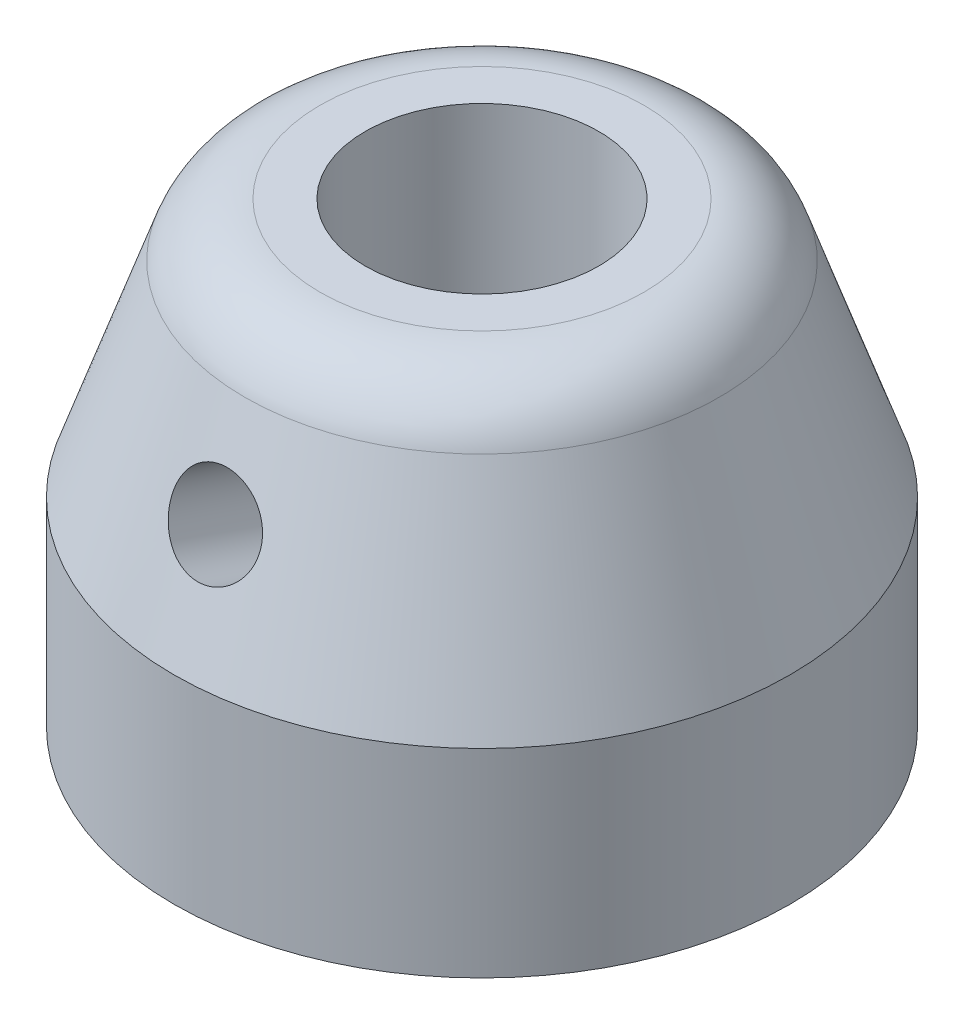
ISO-10303-21;
HEADER;
FILE_DESCRIPTION(('STEP AP214'),'2;1');
FILE_NAME('part.step','',(''),(''),'','','');
FILE_SCHEMA(('AUTOMOTIVE_DESIGN { 1 0 10303 214 1 1 1 1 }'));
ENDSEC;
DATA;
#1=APPLICATION_CONTEXT('core data for automotive mechanical design processes');
#2=APPLICATION_PROTOCOL_DEFINITION('international standard','automotive_design',2000,#1);
#3=PRODUCT_CONTEXT('',#1,'mechanical');
#4=PRODUCT('Part','Part','',(#3));
#5=PRODUCT_RELATED_PRODUCT_CATEGORY('part','',(#4));
#6=PRODUCT_DEFINITION_FORMATION('','',#4);
#7=PRODUCT_DEFINITION_CONTEXT('part definition',#1,'design');
#8=PRODUCT_DEFINITION('design','',#6,#7);
#9=PRODUCT_DEFINITION_SHAPE('','',#8);
#10=(LENGTH_UNIT() NAMED_UNIT(*) SI_UNIT(.MILLI.,.METRE.));
#11=(NAMED_UNIT(*) PLANE_ANGLE_UNIT() SI_UNIT($,.RADIAN.));
#12=(NAMED_UNIT(*) SI_UNIT($,.STERADIAN.) SOLID_ANGLE_UNIT());
#13=UNCERTAINTY_MEASURE_WITH_UNIT(LENGTH_MEASURE(1.E-05),#10,'distance_accuracy_value','');
#14=(GEOMETRIC_REPRESENTATION_CONTEXT(3) GLOBAL_UNCERTAINTY_ASSIGNED_CONTEXT((#13)) GLOBAL_UNIT_ASSIGNED_CONTEXT((#10,
#11,#12)) REPRESENTATION_CONTEXT('',''));
#15=CARTESIAN_POINT('',(0.,0.,0.));
#16=DIRECTION('',(0.,0.,1.));
#17=DIRECTION('',(1.,0.,0.));
#18=AXIS2_PLACEMENT_3D('',#15,#16,#17);
#19=CARTESIAN_POINT('',(0.,46.,0.));
#20=DIRECTION('',(0.,1.,0.));
#21=DIRECTION('',(0.,0.,1.));
#22=AXIS2_PLACEMENT_3D('',#19,#20,#21);
#23=CYLINDRICAL_SURFACE('',#22,11.75);
#24=CARTESIAN_POINT('',(0.,46.,0.));
#25=DIRECTION('',(0.,1.,0.));
#26=DIRECTION('',(0.,0.,1.));
#27=AXIS2_PLACEMENT_3D('',#24,#25,#26);
#28=CIRCLE('',#27,11.75);
#29=CARTESIAN_POINT('',(0.,46.,11.75));
#30=VERTEX_POINT('',#29);
#31=EDGE_CURVE('E69',#30,#30,#28,.T.);
#32=ORIENTED_EDGE('',*,*,#31,.T.);
#33=EDGE_LOOP('',(#32));
#34=FACE_BOUND('',#33,.T.);
#35=CARTESIAN_POINT('',(0.,2.,0.));
#36=DIRECTION('',(0.,-1.,0.));
#37=DIRECTION('',(0.,0.,-1.));
#38=AXIS2_PLACEMENT_3D('',#35,#36,#37);
#39=CIRCLE('',#38,11.75);
#40=CARTESIAN_POINT('',(0.,2.,-11.75));
#41=VERTEX_POINT('',#40);
#42=EDGE_CURVE('E51',#41,#41,#39,.F.);
#43=ORIENTED_EDGE('',*,*,#42,.F.);
#44=EDGE_LOOP('',(#43));
#45=FACE_BOUND('',#44,.T.);
#46=ADVANCED_FACE('F47',(#34,#45),#23,.F.);
#47=CARTESIAN_POINT('',(0.,0.,0.));
#48=DIRECTION('',(0.,-1.,0.));
#49=DIRECTION('',(0.,0.,-1.));
#50=AXIS2_PLACEMENT_3D('',#47,#48,#49);
#51=PLANE('',#50);
#52=CARTESIAN_POINT('',(0.,0.,0.));
#53=DIRECTION('',(0.,-1.,0.));
#54=DIRECTION('',(0.,0.,-1.));
#55=AXIS2_PLACEMENT_3D('',#52,#53,#54);
#56=CIRCLE('',#55,18.2033523408867);
#57=CARTESIAN_POINT('',(0.,0.,18.2033523408867));
#58=VERTEX_POINT('',#57);
#59=EDGE_CURVE('E77',#58,#58,#56,.T.);
#60=ORIENTED_EDGE('',*,*,#59,.F.);
#61=EDGE_LOOP('',(#60));
#62=FACE_BOUND('',#61,.T.);
#63=CARTESIAN_POINT('',(0.,0.,0.));
#64=DIRECTION('',(0.,-1.,0.));
#65=DIRECTION('',(0.,0.,-1.));
#66=AXIS2_PLACEMENT_3D('',#63,#64,#65);
#67=CIRCLE('',#66,31.);
#68=CARTESIAN_POINT('',(0.,0.,-31.));
#69=VERTEX_POINT('',#68);
#70=EDGE_CURVE('E84',#69,#69,#67,.T.);
#71=ORIENTED_EDGE('',*,*,#70,.T.);
#72=EDGE_LOOP('',(#71));
#73=FACE_BOUND('',#72,.T.);
#74=ADVANCED_FACE('F112',(#62,#73),#51,.T.);
#75=CARTESIAN_POINT('',(0.,0.,0.));
#76=DIRECTION('',(0.,-1.,0.));
#77=DIRECTION('',(0.,0.,-1.));
#78=AXIS2_PLACEMENT_3D('',#75,#76,#77);
#79=CYLINDRICAL_SURFACE('',#78,31.);
#80=CARTESIAN_POINT('',(0.,20.,0.));
#81=DIRECTION('',(0.,-1.,0.));
#82=DIRECTION('',(0.,0.,-1.));
#83=AXIS2_PLACEMENT_3D('',#80,#81,#82);
#84=CIRCLE('',#83,31.);
#85=CARTESIAN_POINT('',(0.,20.,-31.));
#86=VERTEX_POINT('',#85);
#87=EDGE_CURVE('E74',#86,#86,#84,.T.);
#88=ORIENTED_EDGE('',*,*,#87,.T.);
#89=EDGE_LOOP('',(#88));
#90=FACE_BOUND('',#89,.T.);
#91=ORIENTED_EDGE('',*,*,#70,.F.);
#92=EDGE_LOOP('',(#91));
#93=FACE_BOUND('',#92,.T.);
#94=ADVANCED_FACE('F122',(#90,#93),#79,.T.);
#95=CARTESIAN_POINT('',(0.,20.,0.));
#96=DIRECTION('',(0.,-1.,0.));
#97=DIRECTION('',(0.,0.,-1.));
#98=AXIS2_PLACEMENT_3D('',#95,#96,#97);
#99=CONICAL_SURFACE('',#98,31.,0.333244301111673);
#100=CARTESIAN_POINT('',(-2.46260693911556,27.5747618757833,28.2709140382285));
#101=CARTESIAN_POINT('',(-2.25250460543924,27.4506629750573,28.3323325987209));
#102=CARTESIAN_POINT('',(-2.03069078654411,27.3426406290022,28.386727084604));
#103=CARTESIAN_POINT('',(-1.56980101775069,27.1615643630404,28.478716232485));
#104=CARTESIAN_POINT('',(-1.33071084404026,27.0885396433992,28.5162968641144));
#105=CARTESIAN_POINT('',(-0.842084685340086,26.9794282409741,28.5726888234384));
#106=CARTESIAN_POINT('',(-0.592548589095182,26.9433419517102,28.5914999511738));
#107=CARTESIAN_POINT('',(-0.0902381697285085,26.9090816530011,28.6093553904057));
#108=CARTESIAN_POINT('',(0.162535487141999,26.9108999646464,28.6084037055548));
#109=CARTESIAN_POINT('',(0.662714114226326,26.952261958809,28.5868561865689));
#110=CARTESIAN_POINT('',(0.910140988608877,26.9915977640555,28.5663685972998));
#111=CARTESIAN_POINT('',(1.39407922020473,27.1066676845841,28.5069674232287));
#112=CARTESIAN_POINT('',(1.63059007168446,27.1824034844074,28.4680529856591));
#113=CARTESIAN_POINT('',(2.0867853001004,27.3686170495014,28.3736291287432));
#114=CARTESIAN_POINT('',(2.30641877604234,27.479195146587,28.3180718076424));
#115=CARTESIAN_POINT('',(2.72209347154464,27.7322807245845,28.1931334571556));
#116=CARTESIAN_POINT('',(2.91813319806142,27.8747902245264,28.1237515536689));
#117=CARTESIAN_POINT('',(3.28307821817624,28.1898144782089,27.9737126446754));
#118=CARTESIAN_POINT('',(3.45170006659393,28.3626084543368,27.8929522229239));
#119=CARTESIAN_POINT('',(3.75477986780634,28.7329700238242,27.7244101120212));
#120=CARTESIAN_POINT('',(3.88923714455248,28.9305381072984,27.6366282839755));
#121=CARTESIAN_POINT('',(4.12043054307521,29.3459754992223,27.4577039384746));
#122=CARTESIAN_POINT('',(4.21707629508737,29.5638919205854,27.3665539327156));
#123=CARTESIAN_POINT('',(4.3693056958823,30.013881521628,27.1849119963629));
#124=CARTESIAN_POINT('',(4.42489214755562,30.2459537337991,27.0944200212668));
#125=CARTESIAN_POINT('',(4.49297036438999,30.7156438720881,26.9183941273334));
#126=CARTESIAN_POINT('',(4.50585967098314,30.9531897830191,26.8328218032166));
#127=CARTESIAN_POINT('',(4.48924694104964,31.429163112231,26.6685430312942));
#128=CARTESIAN_POINT('',(4.45974708614647,31.6675904845163,26.5898362303649));
#129=CARTESIAN_POINT('',(4.35963435230797,32.1366398033669,26.4418908966068));
#130=CARTESIAN_POINT('',(4.28932785084662,32.3673065078697,26.3725865035377));
#131=CARTESIAN_POINT('',(4.1099288003287,32.8159851690245,26.2439443967347));
#132=CARTESIAN_POINT('',(4.00083452976688,33.0339965635004,26.1846071255405));
#133=CARTESIAN_POINT('',(3.7461722312865,33.4523302402573,26.0759685789042));
#134=CARTESIAN_POINT('',(3.60037541446818,33.6525304844324,26.0267339105421));
#135=CARTESIAN_POINT('',(3.27672838346823,34.0277100202927,25.9385605233309));
#136=CARTESIAN_POINT('',(3.09887579882345,34.2026874450749,25.8996225664297));
#137=CARTESIAN_POINT('',(2.7139160880194,34.523781032632,25.8310428879783));
#138=CARTESIAN_POINT('',(2.50651888152933,34.6695716493946,25.8015040679715));
#139=CARTESIAN_POINT('',(2.0696568914137,34.9252213406437,25.7514374125553));
#140=CARTESIAN_POINT('',(1.8401925793091,35.0350811826638,25.730909384659));
#141=CARTESIAN_POINT('',(1.36624107513222,35.2149080641032,25.6980819867804));
#142=CARTESIAN_POINT('',(1.12179393397326,35.2849767240465,25.6857616415738));
#143=CARTESIAN_POINT('',(0.624365156237402,35.3831622395064,25.6686661275519));
#144=CARTESIAN_POINT('',(0.37138426750421,35.4112827613765,25.663890299328));
#145=CARTESIAN_POINT('',(-0.132653486185871,35.4244757639265,25.6616381751029));
#146=CARTESIAN_POINT('',(-0.38369656054798,35.4100653351091,25.6640741986572));
#147=CARTESIAN_POINT('',(-0.879734914540417,35.3398327852855,25.6761867709004));
#148=CARTESIAN_POINT('',(-1.12473023580442,35.284010949444,25.6858632697303));
#149=CARTESIAN_POINT('',(-1.6013127167291,35.1330588892072,25.7129110491153));
#150=CARTESIAN_POINT('',(-1.83292455067435,35.0380038158674,25.7302676230839));
#151=CARTESIAN_POINT('',(-2.27692402781549,34.8117684735125,25.7734018966784));
#152=CARTESIAN_POINT('',(-2.48931024175777,34.680585521637,25.799180221731));
#153=CARTESIAN_POINT('',(-2.89143375020396,34.3845842963627,25.8603320756987));
#154=CARTESIAN_POINT('',(-3.08088544254832,34.2193998487095,25.8958115751586));
#155=CARTESIAN_POINT('',(-3.4291073636822,33.8614824649348,25.976979553456));
#156=CARTESIAN_POINT('',(-3.58787627303749,33.6687483447302,26.0226684711414));
#157=CARTESIAN_POINT('',(-3.87119063667082,33.2602790392302,26.1249832653183));
#158=CARTESIAN_POINT('',(-3.99551431594537,33.0444066731196,26.1816761928413));
#159=CARTESIAN_POINT('',(-4.20494783414985,32.5972238308428,26.3056290635224));
#160=CARTESIAN_POINT('',(-4.29006013073566,32.3659143232725,26.3728883440576));
#161=CARTESIAN_POINT('',(-4.41794029011856,31.8968474878907,26.5163887400993));
#162=CARTESIAN_POINT('',(-4.46106400824875,31.6591622064752,26.5925481360801));
#163=CARTESIAN_POINT('',(-4.50490791769221,31.1824685001827,26.7525029031565));
#164=CARTESIAN_POINT('',(-4.50563172301618,30.9434601898125,26.8362976228357));
#165=CARTESIAN_POINT('',(-4.46486692990208,30.4731206611982,27.0081410774165));
#166=CARTESIAN_POINT('',(-4.42376113016524,30.2417394743771,27.0961443361656));
#167=CARTESIAN_POINT('',(-4.30115214322125,29.7906233425066,27.2739712563468));
#168=CARTESIAN_POINT('',(-4.2196402338122,29.5708909233414,27.3637953068043));
#169=CARTESIAN_POINT('',(-4.01810881941575,29.1477688622045,27.5421370166058));
#170=CARTESIAN_POINT('',(-3.89789918987719,28.9444662426913,27.6306459203541));
#171=CARTESIAN_POINT('',(-3.62255102793654,28.5606259180199,27.8020827331858));
#172=CARTESIAN_POINT('',(-3.46744177389391,28.3800693274495,27.8850152451608));
#173=CARTESIAN_POINT('',(-3.17295628883144,28.0913995612987,28.0203537380009));
#174=CARTESIAN_POINT('',(-3.0407297860147,27.9769226721569,28.0749371139887));
#175=CARTESIAN_POINT('',(-2.76193494657285,27.7637181866229,28.1778894295684));
#176=CARTESIAN_POINT('',(-2.61536648664162,27.6649907256569,28.2262583157225));
#177=CARTESIAN_POINT('',(-2.46260693911556,27.5747618757833,28.2709140382285));
#178=B_SPLINE_CURVE_WITH_KNOTS('',3,(#100,#101,#102,#103,#104,#105,#106,#107,#108,#109,#110,
#111,#112,#113,#114,#115,#116,#117,#118,#119,#120,#121,#122,#123,#124,#125,#126,#127,#128,#129,
#130,#131,#132,#133,#134,#135,#136,#137,#138,#139,#140,#141,#142,#143,#144,#145,#146,#147,#148,
#149,#150,#151,#152,#153,#154,#155,#156,#157,#158,#159,#160,#161,#162,#163,#164,#165,#166,#167,
#168,#169,#170,#171,#172,#173,#174,#175,#176,#177),.UNSPECIFIED.,.T.,.F.,(4,2,2,2,2,2,2,2,2,2,2,
2,2,2,2,2,2,2,2,2,2,2,2,2,2,2,2,2,2,2,2,2,2,2,2,2,2,2,4),(0.,0.754224991941485,1.50907818057752,
2.26393941088635,3.01864771900309,3.76919847864079,4.51978397606576,5.27255092088771,
6.02536547677568,6.78552601564501,7.54570159540045,8.30768305980346,9.06961250315273,
9.82442758760133,10.5792038257203,11.3283851703652,12.0775997698395,12.831605612557,
13.5856672354677,14.3477208968817,15.1097582786585,15.8698406804009,16.6298566454892,
17.380670563454,18.1314793112566,18.8808565146195,19.6302893818304,20.3882604066806,
21.1462640188775,21.9090402434612,22.6717686529347,23.4279751311387,24.1841171530243,
24.9334011147254,25.6828468899208,26.4360324254595,27.1885884311911,27.7369596740826,
28.2853356320543),.UNSPECIFIED.);
#179=CARTESIAN_POINT('',(-2.46260693911556,27.5747618757833,28.2709140382285));
#180=VERTEX_POINT('',#179);
#181=EDGE_CURVE('E11',#180,#180,#178,.T.);
#182=ORIENTED_EDGE('',*,*,#181,.F.);
#183=EDGE_LOOP('',(#182));
#184=FACE_BOUND('',#183,.T.);
#185=CARTESIAN_POINT('',(0.,40.6168845110653,0.));
#186=DIRECTION('',(0.,1.,0.));
#187=DIRECTION('',(0.,0.,1.));
#188=AXIS2_PLACEMENT_3D('',#185,#186,#187);
#189=CIRCLE('',#188,23.8633861307851);
#190=CARTESIAN_POINT('',(0.,40.6168845110653,23.8633861307851));
#191=VERTEX_POINT('',#190);
#192=EDGE_CURVE('E88',#191,#191,#189,.F.);
#193=ORIENTED_EDGE('',*,*,#192,.T.);
#194=EDGE_LOOP('',(#193));
#195=FACE_BOUND('',#194,.T.);
#196=ORIENTED_EDGE('',*,*,#87,.F.);
#197=EDGE_LOOP('',(#196));
#198=FACE_BOUND('',#197,.T.);
#199=ADVANCED_FACE('F99',(#184,#195,#198),#99,.T.);
#200=CARTESIAN_POINT('',(22.,46.,0.));
#201=DIRECTION('',(0.,1.,0.));
#202=DIRECTION('',(0.,0.,1.));
#203=AXIS2_PLACEMENT_3D('',#200,#201,#202);
#204=PLANE('',#203);
#205=CARTESIAN_POINT('',(0.,46.,0.));
#206=DIRECTION('',(0.,1.,0.));
#207=DIRECTION('',(0.,0.,1.));
#208=AXIS2_PLACEMENT_3D('',#205,#206,#207);
#209=CIRCLE('',#208,16.303497543263);
#210=CARTESIAN_POINT('',(0.,46.,16.303497543263));
#211=VERTEX_POINT('',#210);
#212=EDGE_CURVE('E56',#211,#211,#209,.T.);
#213=ORIENTED_EDGE('',*,*,#212,.T.);
#214=EDGE_LOOP('',(#213));
#215=FACE_BOUND('',#214,.T.);
#216=ORIENTED_EDGE('',*,*,#31,.F.);
#217=EDGE_LOOP('',(#216));
#218=FACE_BOUND('',#217,.T.);
#219=ADVANCED_FACE('F114',(#215,#218),#204,.T.);
#220=CARTESIAN_POINT('',(0.,38.,0.));
#221=DIRECTION('',(0.,1.,0.));
#222=DIRECTION('',(0.,0.,1.));
#223=AXIS2_PLACEMENT_3D('',#220,#221,#222);
#224=TOROIDAL_SURFACE('',#223,16.303497543263,8.);
#225=ORIENTED_EDGE('',*,*,#212,.F.);
#226=EDGE_LOOP('',(#225));
#227=FACE_BOUND('',#226,.T.);
#228=ORIENTED_EDGE('',*,*,#192,.F.);
#229=EDGE_LOOP('',(#228));
#230=FACE_BOUND('',#229,.T.);
#231=ADVANCED_FACE('F49',(#227,#230),#224,.T.);
#232=CARTESIAN_POINT('',(0.,27.8959181378311,17.6846310352142));
#233=DIRECTION('',(0.,0.327110563883166,0.944986073440258));
#234=DIRECTION('',(0.,-0.944986073440258,0.327110563883166));
#235=AXIS2_PLACEMENT_3D('',#232,#233,#234);
#236=CONICAL_SURFACE('',#235,4.5,1.02974425867665);
#237=CARTESIAN_POINT('',(0.,27.0114527862573,15.1295089084453));
#238=VERTEX_POINT('',#237);
#239=VERTEX_LOOP('',#238);
#240=FACE_BOUND('',#239,.T.);
#241=CARTESIAN_POINT('',(0.,27.8959181378311,17.6846310352142));
#242=DIRECTION('',(0.,0.327110563883166,0.944986073440258));
#243=DIRECTION('',(0.,-0.944986073440258,0.327110563883166));
#244=AXIS2_PLACEMENT_3D('',#241,#242,#243);
#245=CIRCLE('',#244,4.5);
#246=CARTESIAN_POINT('',(0.,23.6434808073499,19.1566285726884));
#247=VERTEX_POINT('',#246);
#248=EDGE_CURVE('E66',#247,#247,#245,.T.);
#249=ORIENTED_EDGE('',*,*,#248,.T.);
#250=EDGE_LOOP('',(#249));
#251=FACE_BOUND('',#250,.T.);
#252=ADVANCED_FACE('F59',(#240,#251),#236,.F.);
#253=CARTESIAN_POINT('',(0.,31.1670237766628,27.1344917696167));
#254=DIRECTION('',(0.,0.327110563883166,0.944986073440258));
#255=DIRECTION('',(0.,-0.944986073440258,0.327110563883166));
#256=AXIS2_PLACEMENT_3D('',#253,#254,#255);
#257=CYLINDRICAL_SURFACE('',#256,4.49999999999999);
#258=ORIENTED_EDGE('',*,*,#181,.T.);
#259=EDGE_LOOP('',(#258));
#260=FACE_BOUND('',#259,.T.);
#261=ORIENTED_EDGE('',*,*,#248,.F.);
#262=EDGE_LOOP('',(#261));
#263=FACE_BOUND('',#262,.T.);
#264=ADVANCED_FACE('F62',(#260,#263),#257,.F.);
#265=CARTESIAN_POINT('',(0.,2.,0.));
#266=DIRECTION('',(0.,-1.,0.));
#267=DIRECTION('',(0.,0.,-1.));
#268=AXIS2_PLACEMENT_3D('',#265,#266,#267);
#269=PLANE('',#268);
#270=CARTESIAN_POINT('',(0.,2.,0.));
#271=DIRECTION('',(0.,-1.,0.));
#272=DIRECTION('',(0.,0.,-1.));
#273=AXIS2_PLACEMENT_3D('',#270,#271,#272);
#274=CIRCLE('',#273,12.5);
#275=CARTESIAN_POINT('',(0.,2.,12.5));
#276=VERTEX_POINT('',#275);
#277=EDGE_CURVE('E139',#276,#276,#274,.T.);
#278=ORIENTED_EDGE('',*,*,#277,.T.);
#279=EDGE_LOOP('',(#278));
#280=FACE_BOUND('',#279,.T.);
#281=ORIENTED_EDGE('',*,*,#42,.T.);
#282=EDGE_LOOP('',(#281));
#283=FACE_BOUND('',#282,.T.);
#284=ADVANCED_FACE('F106',(#280,#283),#269,.T.);
#285=CARTESIAN_POINT('',(0.,-42.7780091116164,0.));
#286=DIRECTION('',(0.,-1.,0.));
#287=DIRECTION('',(0.,0.,1.));
#288=AXIS2_PLACEMENT_3D('',#285,#286,#287);
#289=SPHERICAL_SURFACE('',#288,46.49);
#290=CARTESIAN_POINT('',(0.,0.,18.2033523408867));
#291=CARTESIAN_POINT('',(0.,0.0246684133572685,18.145381393763));
#292=CARTESIAN_POINT('',(0.,0.0492189856771059,18.0873603016764));
#293=CARTESIAN_POINT('',(0.,0.0980840455462954,17.9712187878479));
#294=CARTESIAN_POINT('',(0.,0.122398533095648,17.9130983661059));
#295=CARTESIAN_POINT('',(0.,0.170791020728241,17.7967591532368));
#296=CARTESIAN_POINT('',(0.,0.194869020811483,17.7385403621096));
#297=CARTESIAN_POINT('',(0.,0.242788135770466,17.6220053728059));
#298=CARTESIAN_POINT('',(0.,0.266629250646208,17.5636891746294));
#299=CARTESIAN_POINT('',(0.,0.314074201083891,17.4469603350552));
#300=CARTESIAN_POINT('',(0.,0.337678036645833,17.3885476936575));
#301=CARTESIAN_POINT('',(0.,0.384648038346454,17.2716269330944));
#302=CARTESIAN_POINT('',(0.,0.408014204485133,17.213118813929));
#303=CARTESIAN_POINT('',(0.,0.454508481137847,17.0960080648539));
#304=CARTESIAN_POINT('',(0.,0.477636591651881,17.0374054349441));
#305=CARTESIAN_POINT('',(0.,0.523654374793932,16.9201066329678));
#306=CARTESIAN_POINT('',(0.,0.546544047421947,16.8614104609012));
#307=CARTESIAN_POINT('',(0.,0.592084576470035,16.7439255447442));
#308=CARTESIAN_POINT('',(0.,0.614735432890108,16.6851368006538));
#309=CARTESIAN_POINT('',(0.,0.659797955147947,16.5674677121124));
#310=CARTESIAN_POINT('',(0.,0.682209620985715,16.5085873676614));
#311=CARTESIAN_POINT('',(0.,0.72679339165783,16.390736051576));
#312=CARTESIAN_POINT('',(0.,0.748965496492178,16.3317650799416));
#313=CARTESIAN_POINT('',(0.,0.793069778695842,16.2137334841645));
#314=CARTESIAN_POINT('',(0.,0.815001956065158,16.1546728600217));
#315=CARTESIAN_POINT('',(0.,0.858626020842672,16.0364629353847));
#316=CARTESIAN_POINT('',(0.,0.88031790825087,15.9773136348905));
#317=CARTESIAN_POINT('',(0.,0.923461034581588,15.8589273351729));
#318=CARTESIAN_POINT('',(0.,0.944912273504109,15.7996903359496));
#319=CARTESIAN_POINT('',(0.,0.987573748316364,15.681129617846));
#320=CARTESIAN_POINT('',(0.,1.0087839842061,15.6218058989657));
#321=CARTESIAN_POINT('',(0.,1.05096310238898,15.5030727220533));
#322=CARTESIAN_POINT('',(0.,1.07193198468213,15.4436632640212));
#323=CARTESIAN_POINT('',(0.,1.11362804909713,15.3247595907277));
#324=CARTESIAN_POINT('',(0.,1.134355231219,15.2652653754662));
#325=CARTESIAN_POINT('',(0.,1.17556755271157,15.1461931710372));
#326=CARTESIAN_POINT('',(0.,1.19605269208228,15.0866151818696));
#327=CARTESIAN_POINT('',(0.,1.23678058949318,14.9673764143362));
#328=CARTESIAN_POINT('',(0.,1.25702334753338,14.9077156359703));
#329=CARTESIAN_POINT('',(0.,1.29726614770996,14.7883122761167));
#330=CARTESIAN_POINT('',(0.,1.31726618984635,14.7285696946288));
#331=CARTESIAN_POINT('',(0.,1.35702322765367,14.6090037159593));
#332=CARTESIAN_POINT('',(0.,1.3767802233246,14.5491803187777));
#333=CARTESIAN_POINT('',(0.,1.41605084165642,14.4294536974847));
#334=CARTESIAN_POINT('',(0.,1.43556446431732,14.3695504733734));
#335=CARTESIAN_POINT('',(0.,1.47434801410697,14.2496651883042));
#336=CARTESIAN_POINT('',(0.,1.49361794123573,14.1896831273464));
#337=CARTESIAN_POINT('',(0.,1.53191378146685,14.0696411599709));
#338=CARTESIAN_POINT('',(0.,1.55093969456921,14.0095812535531));
#339=CARTESIAN_POINT('',(0.,1.58874719228623,13.8893845879306));
#340=CARTESIAN_POINT('',(0.,1.60752877690089,13.8292478287258));
#341=CARTESIAN_POINT('',(0.,1.64484730721992,13.7088984514726));
#342=CARTESIAN_POINT('',(0.,1.66338425292428,13.6486858334242));
#343=CARTESIAN_POINT('',(0.,1.70021319904196,13.5281857336805));
#344=CARTESIAN_POINT('',(0.,1.71850519945529,13.4678982519851));
#345=CARTESIAN_POINT('',(0.,1.75484395266429,13.3472494213831));
#346=CARTESIAN_POINT('',(0.,1.77289070545996,13.2868880724765));
#347=CARTESIAN_POINT('',(0.,1.80873866513949,13.1660925051026));
#348=CARTESIAN_POINT('',(0.,1.82653987202335,13.1056582866353));
#349=CARTESIAN_POINT('',(0.,1.86189644572183,12.9847179790172));
#350=CARTESIAN_POINT('',(0.,1.87945181253647,12.9242118898664));
#351=CARTESIAN_POINT('',(0.,1.91431641570994,12.8031288408634));
#352=CARTESIAN_POINT('',(0.,1.93162565206878,12.7425518810113));
#353=CARTESIAN_POINT('',(0.,1.96599770910345,12.6213280920687));
#354=CARTESIAN_POINT('',(0.,1.98306052977928,12.5606812629782));
#355=CARTESIAN_POINT('',(0.,2.,12.5));
#356=B_SPLINE_CURVE_WITH_KNOTS('',3,(#290,#291,#292,#293,#294,#295,#296,#297,#298,#299,#300,
#301,#302,#303,#304,#305,#306,#307,#308,#309,#310,#311,#312,#313,#314,#315,#316,#317,#318,#319,
#320,#321,#322,#323,#324,#325,#326,#327,#328,#329,#330,#331,#332,#333,#334,#335,#336,#337,#338,
#339,#340,#341,#342,#343,#344,#345,#346,#347,#348,#349,#350,#351,#352,#353,#354,#355),
.UNSPECIFIED.,.F.,.F.,(4,2,2,2,2,2,2,2,2,2,2,2,2,2,2,2,2,2,2,2,2,2,2,2,2,2,2,2,2,2,2,2,4),(0.,
0.189003710933403,0.378007421866815,0.567011132800226,0.756014843733629,0.945018554667031,
1.13402226560044,1.32302597653385,1.51202968746725,1.70103339840066,1.89003710933407,
2.07904082026748,2.26804453120088,2.45704824213429,2.6460519530677,2.83505566400111,
3.02405937493451,3.21306308586792,3.40206679680133,3.59107050773474,3.78007421866814,
3.96907792960154,4.15808164053495,4.34708535146837,4.53608906240177,4.72509277333517,
4.91409648426858,5.10310019520199,5.2921039061354,5.4811076170688,5.67011132800221,
5.85911503893562,6.04811874986903),.UNSPECIFIED.);
#357=EDGE_CURVE('BSEAM108',#58,#276,#356,.T.);
#358=ORIENTED_EDGE('',*,*,#59,.T.);
#359=ORIENTED_EDGE('',*,*,#277,.F.);
#360=ORIENTED_EDGE('',*,*,#357,.T.);
#361=ORIENTED_EDGE('',*,*,#357,.F.);
#362=EDGE_LOOP('',(#358,#360,#359,#361));
#363=FACE_BOUND('',#362,.T.);
#364=ADVANCED_FACE('F108',(#363),#289,.F.);
#365=CLOSED_SHELL('',(#46,#74,#94,#199,#219,#231,#252,#264,#284,#364));
#366=MANIFOLD_SOLID_BREP('B2',#365);
#367=ADVANCED_BREP_SHAPE_REPRESENTATION('',(#18,#366),#14);
#368=SHAPE_DEFINITION_REPRESENTATION(#9,#367);
ENDSEC;
END-ISO-10303-21;
